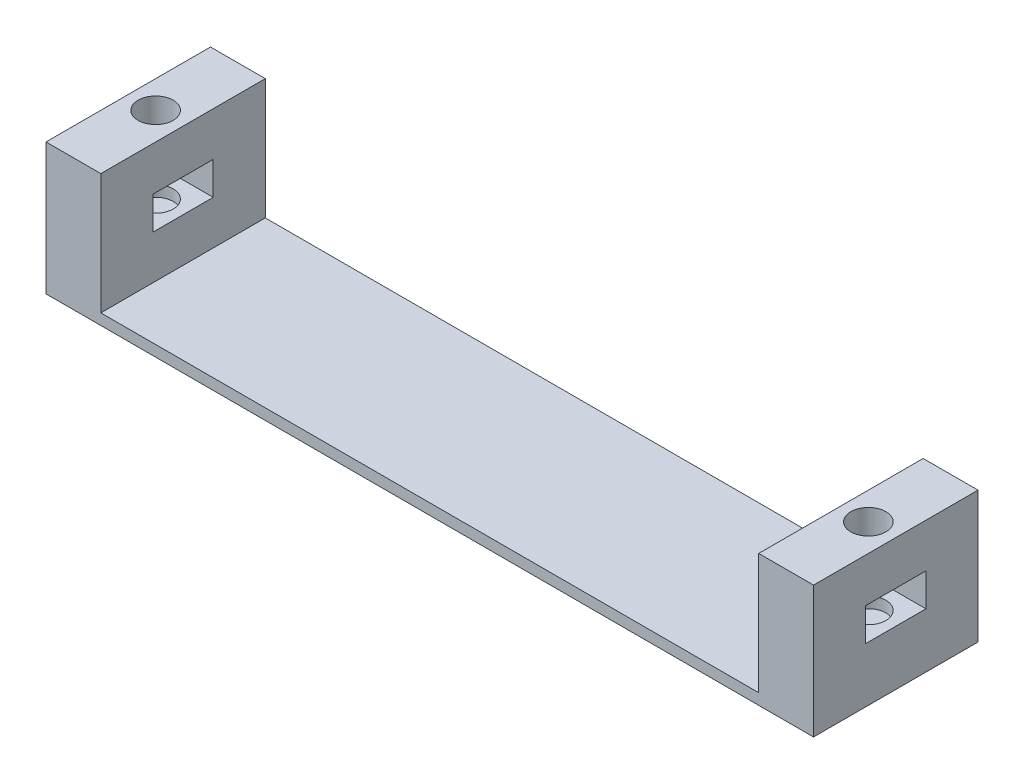
ISO-10303-21;
HEADER;
FILE_DESCRIPTION(('STEP AP214'),'2;1');
FILE_NAME('part.step','',(''),(''),'','','');
FILE_SCHEMA(('AUTOMOTIVE_DESIGN { 1 0 10303 214 1 1 1 1 }'));
ENDSEC;
DATA;
#1=APPLICATION_CONTEXT('core data for automotive mechanical design processes');
#2=APPLICATION_PROTOCOL_DEFINITION('international standard','automotive_design',2000,#1);
#3=PRODUCT_CONTEXT('',#1,'mechanical');
#4=PRODUCT('Part','Part','',(#3));
#5=PRODUCT_RELATED_PRODUCT_CATEGORY('part','',(#4));
#6=PRODUCT_DEFINITION_FORMATION('','',#4);
#7=PRODUCT_DEFINITION_CONTEXT('part definition',#1,'design');
#8=PRODUCT_DEFINITION('design','',#6,#7);
#9=PRODUCT_DEFINITION_SHAPE('','',#8);
#10=(LENGTH_UNIT() NAMED_UNIT(*) SI_UNIT(.MILLI.,.METRE.));
#11=(NAMED_UNIT(*) PLANE_ANGLE_UNIT() SI_UNIT($,.RADIAN.));
#12=(NAMED_UNIT(*) SI_UNIT($,.STERADIAN.) SOLID_ANGLE_UNIT());
#13=UNCERTAINTY_MEASURE_WITH_UNIT(LENGTH_MEASURE(1.E-05),#10,'distance_accuracy_value','');
#14=(GEOMETRIC_REPRESENTATION_CONTEXT(3) GLOBAL_UNCERTAINTY_ASSIGNED_CONTEXT((#13)) GLOBAL_UNIT_ASSIGNED_CONTEXT((#10,
#11,#12)) REPRESENTATION_CONTEXT('',''));
#15=CARTESIAN_POINT('',(0.,0.,0.));
#16=DIRECTION('',(0.,0.,1.));
#17=DIRECTION('',(1.,0.,0.));
#18=AXIS2_PLACEMENT_3D('',#15,#16,#17);
#19=CARTESIAN_POINT('',(32.5,4.,-1.22298005056365E-13));
#20=DIRECTION('',(0.,1.,0.));
#21=DIRECTION('',(0.,0.,1.));
#22=AXIS2_PLACEMENT_3D('',#19,#20,#21);
#23=CYLINDRICAL_SURFACE('',#22,1.6);
#24=CARTESIAN_POINT('',(32.5,8.,-1.22298005056365E-13));
#25=DIRECTION('',(0.,1.,0.));
#26=DIRECTION('',(0.,0.,1.));
#27=AXIS2_PLACEMENT_3D('',#24,#25,#26);
#28=CIRCLE('',#27,1.6);
#29=CARTESIAN_POINT('',(32.5,8.,1.59999999999988));
#30=VERTEX_POINT('',#29);
#31=EDGE_CURVE('E204',#30,#30,#28,.F.);
#32=ORIENTED_EDGE('',*,*,#31,.T.);
#33=EDGE_LOOP('',(#32));
#34=FACE_BOUND('',#33,.T.);
#35=CARTESIAN_POINT('',(32.5,12.,-1.22298005056365E-13));
#36=DIRECTION('',(0.,1.,0.));
#37=DIRECTION('',(0.,0.,-1.));
#38=AXIS2_PLACEMENT_3D('',#35,#36,#37);
#39=CIRCLE('',#38,1.6);
#40=CARTESIAN_POINT('',(32.5,12.,-1.60000000000012));
#41=VERTEX_POINT('',#40);
#42=EDGE_CURVE('E217',#41,#41,#39,.T.);
#43=ORIENTED_EDGE('',*,*,#42,.T.);
#44=EDGE_LOOP('',(#43));
#45=FACE_BOUND('',#44,.T.);
#46=ADVANCED_FACE('F33',(#34,#45),#23,.F.);
#47=CARTESIAN_POINT('',(-32.5,4.,0.));
#48=DIRECTION('',(0.,1.,0.));
#49=DIRECTION('',(0.,0.,1.));
#50=AXIS2_PLACEMENT_3D('',#47,#48,#49);
#51=CYLINDRICAL_SURFACE('',#50,1.6);
#52=CARTESIAN_POINT('',(-32.5,8.,0.));
#53=DIRECTION('',(0.,1.,0.));
#54=DIRECTION('',(0.,0.,1.));
#55=AXIS2_PLACEMENT_3D('',#52,#53,#54);
#56=CIRCLE('',#55,1.6);
#57=CARTESIAN_POINT('',(-32.5,8.,1.6));
#58=VERTEX_POINT('',#57);
#59=EDGE_CURVE('E203',#58,#58,#56,.F.);
#60=ORIENTED_EDGE('',*,*,#59,.T.);
#61=EDGE_LOOP('',(#60));
#62=FACE_BOUND('',#61,.T.);
#63=CARTESIAN_POINT('',(-32.5,12.,0.));
#64=DIRECTION('',(0.,1.,0.));
#65=DIRECTION('',(0.,0.,1.));
#66=AXIS2_PLACEMENT_3D('',#63,#64,#65);
#67=CIRCLE('',#66,1.6);
#68=CARTESIAN_POINT('',(-32.5,12.,1.6));
#69=VERTEX_POINT('',#68);
#70=EDGE_CURVE('E222',#69,#69,#67,.T.);
#71=ORIENTED_EDGE('',*,*,#70,.T.);
#72=EDGE_LOOP('',(#71));
#73=FACE_BOUND('',#72,.T.);
#74=ADVANCED_FACE('F347',(#62,#73),#51,.F.);
#75=CARTESIAN_POINT('',(0.,1.,0.));
#76=DIRECTION('',(0.,-1.,0.));
#77=DIRECTION('',(0.,0.,-1.));
#78=AXIS2_PLACEMENT_3D('',#75,#76,#77);
#79=PLANE('',#78);
#80=DIRECTION('',(0.,0.,1.));
#81=VECTOR('',#80,1.);
#82=CARTESIAN_POINT('',(30.,1.,7.5));
#83=LINE('',#82,#81);
#84=CARTESIAN_POINT('',(30.,1.,-7.5));
#85=VERTEX_POINT('',#84);
#86=CARTESIAN_POINT('',(30.,1.,7.5));
#87=VERTEX_POINT('',#86);
#88=EDGE_CURVE('E221',#85,#87,#83,.T.);
#89=ORIENTED_EDGE('',*,*,#88,.F.);
#90=DIRECTION('',(-1.,0.,0.));
#91=VECTOR('',#90,1.);
#92=CARTESIAN_POINT('',(-35.,1.,-7.5));
#93=LINE('',#92,#91);
#94=CARTESIAN_POINT('',(-30.,1.,-7.5));
#95=VERTEX_POINT('',#94);
#96=EDGE_CURVE('E269',#85,#95,#93,.T.);
#97=ORIENTED_EDGE('',*,*,#96,.T.);
#98=DIRECTION('',(0.,0.,-1.));
#99=VECTOR('',#98,1.);
#100=CARTESIAN_POINT('',(-30.,1.,-7.5));
#101=LINE('',#100,#99);
#102=CARTESIAN_POINT('',(-30.,1.,7.5));
#103=VERTEX_POINT('',#102);
#104=EDGE_CURVE('E249',#103,#95,#101,.T.);
#105=ORIENTED_EDGE('',*,*,#104,.F.);
#106=DIRECTION('',(1.,0.,0.));
#107=VECTOR('',#106,1.);
#108=CARTESIAN_POINT('',(-35.,1.,7.5));
#109=LINE('',#108,#107);
#110=EDGE_CURVE('E271',#103,#87,#109,.T.);
#111=ORIENTED_EDGE('',*,*,#110,.T.);
#112=EDGE_LOOP('',(#89,#97,#105,#111));
#113=FACE_BOUND('',#112,.T.);
#114=ADVANCED_FACE('F317',(#113),#79,.F.);
#115=CARTESIAN_POINT('',(35.,1.,7.5));
#116=DIRECTION('',(-1.,0.,0.));
#117=DIRECTION('',(0.,0.,1.));
#118=AXIS2_PLACEMENT_3D('',#115,#116,#117);
#119=PLANE('',#118);
#120=DIRECTION('',(0.,0.,-1.));
#121=VECTOR('',#120,1.);
#122=CARTESIAN_POINT('',(35.,5.,-2.75));
#123=LINE('',#122,#121);
#124=CARTESIAN_POINT('',(35.,5.,2.75));
#125=VERTEX_POINT('',#124);
#126=CARTESIAN_POINT('',(35.,5.,-2.75));
#127=VERTEX_POINT('',#126);
#128=EDGE_CURVE('E181',#125,#127,#123,.T.);
#129=ORIENTED_EDGE('',*,*,#128,.F.);
#130=DIRECTION('',(0.,-1.,0.));
#131=VECTOR('',#130,1.);
#132=CARTESIAN_POINT('',(35.,5.,2.75));
#133=LINE('',#132,#131);
#134=CARTESIAN_POINT('',(35.,8.,2.75));
#135=VERTEX_POINT('',#134);
#136=EDGE_CURVE('E48',#135,#125,#133,.T.);
#137=ORIENTED_EDGE('',*,*,#136,.F.);
#138=DIRECTION('',(0.,0.,1.));
#139=VECTOR('',#138,1.);
#140=CARTESIAN_POINT('',(35.,8.,2.75));
#141=LINE('',#140,#139);
#142=CARTESIAN_POINT('',(35.,8.,-2.75));
#143=VERTEX_POINT('',#142);
#144=EDGE_CURVE('E172',#143,#135,#141,.T.);
#145=ORIENTED_EDGE('',*,*,#144,.F.);
#146=DIRECTION('',(0.,1.,0.));
#147=VECTOR('',#146,1.);
#148=CARTESIAN_POINT('',(35.,5.,-2.75));
#149=LINE('',#148,#147);
#150=EDGE_CURVE('E175',#127,#143,#149,.T.);
#151=ORIENTED_EDGE('',*,*,#150,.F.);
#152=EDGE_LOOP('',(#129,#137,#145,#151));
#153=FACE_BOUND('',#152,.T.);
#154=DIRECTION('',(0.,0.,-1.));
#155=VECTOR('',#154,1.);
#156=CARTESIAN_POINT('',(35.,0.,7.5));
#157=LINE('',#156,#155);
#158=CARTESIAN_POINT('',(35.,0.,7.5));
#159=VERTEX_POINT('',#158);
#160=CARTESIAN_POINT('',(35.,0.,-7.5));
#161=VERTEX_POINT('',#160);
#162=EDGE_CURVE('E268',#159,#161,#157,.T.);
#163=ORIENTED_EDGE('',*,*,#162,.T.);
#164=DIRECTION('',(0.,-1.,0.));
#165=VECTOR('',#164,1.);
#166=CARTESIAN_POINT('',(35.,1.,-7.5));
#167=LINE('',#166,#165);
#168=CARTESIAN_POINT('',(35.,12.,-7.5));
#169=VERTEX_POINT('',#168);
#170=EDGE_CURVE('E290',#169,#161,#167,.T.);
#171=ORIENTED_EDGE('',*,*,#170,.F.);
#172=DIRECTION('',(0.,0.,-1.));
#173=VECTOR('',#172,1.);
#174=CARTESIAN_POINT('',(35.,12.,-7.5));
#175=LINE('',#174,#173);
#176=CARTESIAN_POINT('',(35.,12.,7.5));
#177=VERTEX_POINT('',#176);
#178=EDGE_CURVE('E238',#177,#169,#175,.T.);
#179=ORIENTED_EDGE('',*,*,#178,.F.);
#180=DIRECTION('',(0.,-1.,0.));
#181=VECTOR('',#180,1.);
#182=CARTESIAN_POINT('',(35.,1.,7.5));
#183=LINE('',#182,#181);
#184=EDGE_CURVE('E274',#177,#159,#183,.T.);
#185=ORIENTED_EDGE('',*,*,#184,.T.);
#186=EDGE_LOOP('',(#163,#171,#179,#185));
#187=FACE_BOUND('',#186,.T.);
#188=ADVANCED_FACE('F35',(#153,#187),#119,.F.);
#189=CARTESIAN_POINT('',(-35.,1.,-7.5));
#190=DIRECTION('',(0.,0.,1.));
#191=DIRECTION('',(1.,0.,0.));
#192=AXIS2_PLACEMENT_3D('',#189,#190,#191);
#193=PLANE('',#192);
#194=DIRECTION('',(-1.,0.,0.));
#195=VECTOR('',#194,1.);
#196=CARTESIAN_POINT('',(-35.,0.,-7.5));
#197=LINE('',#196,#195);
#198=CARTESIAN_POINT('',(-35.,0.,-7.5));
#199=VERTEX_POINT('',#198);
#200=EDGE_CURVE('E277',#161,#199,#197,.T.);
#201=ORIENTED_EDGE('',*,*,#200,.T.);
#202=DIRECTION('',(0.,-1.,0.));
#203=VECTOR('',#202,1.);
#204=CARTESIAN_POINT('',(-35.,1.,-7.5));
#205=LINE('',#204,#203);
#206=CARTESIAN_POINT('',(-35.,12.,-7.5));
#207=VERTEX_POINT('',#206);
#208=EDGE_CURVE('E287',#207,#199,#205,.T.);
#209=ORIENTED_EDGE('',*,*,#208,.F.);
#210=DIRECTION('',(-1.,0.,0.));
#211=VECTOR('',#210,1.);
#212=CARTESIAN_POINT('',(-35.,12.,-7.5));
#213=LINE('',#212,#211);
#214=CARTESIAN_POINT('',(-30.,12.,-7.5));
#215=VERTEX_POINT('',#214);
#216=EDGE_CURVE('E257',#215,#207,#213,.T.);
#217=ORIENTED_EDGE('',*,*,#216,.F.);
#218=DIRECTION('',(0.,-1.,0.));
#219=VECTOR('',#218,1.);
#220=CARTESIAN_POINT('',(-30.,12.,-7.5));
#221=LINE('',#220,#219);
#222=EDGE_CURVE('E260',#215,#95,#221,.T.);
#223=ORIENTED_EDGE('',*,*,#222,.T.);
#224=ORIENTED_EDGE('',*,*,#96,.F.);
#225=DIRECTION('',(0.,-1.,0.));
#226=VECTOR('',#225,1.);
#227=CARTESIAN_POINT('',(30.,12.,-7.5));
#228=LINE('',#227,#226);
#229=CARTESIAN_POINT('',(30.,12.,-7.5));
#230=VERTEX_POINT('',#229);
#231=EDGE_CURVE('E246',#230,#85,#228,.T.);
#232=ORIENTED_EDGE('',*,*,#231,.F.);
#233=DIRECTION('',(-1.,0.,0.));
#234=VECTOR('',#233,1.);
#235=CARTESIAN_POINT('',(30.,12.,-7.5));
#236=LINE('',#235,#234);
#237=EDGE_CURVE('E230',#169,#230,#236,.T.);
#238=ORIENTED_EDGE('',*,*,#237,.F.);
#239=ORIENTED_EDGE('',*,*,#170,.T.);
#240=EDGE_LOOP('',(#201,#209,#217,#223,#224,#232,#238,#239));
#241=FACE_BOUND('',#240,.T.);
#242=ADVANCED_FACE('F316',(#241),#193,.F.);
#243=CARTESIAN_POINT('',(-35.,1.,7.5));
#244=DIRECTION('',(1.,0.,0.));
#245=DIRECTION('',(0.,0.,-1.));
#246=AXIS2_PLACEMENT_3D('',#243,#244,#245);
#247=PLANE('',#246);
#248=DIRECTION('',(0.,0.,1.));
#249=VECTOR('',#248,1.);
#250=CARTESIAN_POINT('',(-35.,8.,2.75));
#251=LINE('',#250,#249);
#252=CARTESIAN_POINT('',(-35.,8.,-2.75));
#253=VERTEX_POINT('',#252);
#254=CARTESIAN_POINT('',(-35.,8.,2.75));
#255=VERTEX_POINT('',#254);
#256=EDGE_CURVE('E171',#253,#255,#251,.T.);
#257=ORIENTED_EDGE('',*,*,#256,.T.);
#258=DIRECTION('',(0.,-1.,0.));
#259=VECTOR('',#258,1.);
#260=CARTESIAN_POINT('',(-35.,5.,2.75));
#261=LINE('',#260,#259);
#262=CARTESIAN_POINT('',(-35.,5.,2.75));
#263=VERTEX_POINT('',#262);
#264=EDGE_CURVE('E153',#255,#263,#261,.T.);
#265=ORIENTED_EDGE('',*,*,#264,.T.);
#266=DIRECTION('',(0.,0.,-1.));
#267=VECTOR('',#266,1.);
#268=CARTESIAN_POINT('',(-35.,5.,-2.75));
#269=LINE('',#268,#267);
#270=CARTESIAN_POINT('',(-35.,5.,-2.75));
#271=VERTEX_POINT('',#270);
#272=EDGE_CURVE('E163',#263,#271,#269,.T.);
#273=ORIENTED_EDGE('',*,*,#272,.T.);
#274=DIRECTION('',(0.,1.,0.));
#275=VECTOR('',#274,1.);
#276=CARTESIAN_POINT('',(-35.,5.,-2.75));
#277=LINE('',#276,#275);
#278=EDGE_CURVE('E56',#271,#253,#277,.T.);
#279=ORIENTED_EDGE('',*,*,#278,.T.);
#280=EDGE_LOOP('',(#257,#265,#273,#279));
#281=FACE_BOUND('',#280,.T.);
#282=DIRECTION('',(0.,0.,1.));
#283=VECTOR('',#282,1.);
#284=CARTESIAN_POINT('',(-35.,0.,7.5));
#285=LINE('',#284,#283);
#286=CARTESIAN_POINT('',(-35.,0.,7.5));
#287=VERTEX_POINT('',#286);
#288=EDGE_CURVE('E279',#199,#287,#285,.T.);
#289=ORIENTED_EDGE('',*,*,#288,.T.);
#290=DIRECTION('',(0.,-1.,0.));
#291=VECTOR('',#290,1.);
#292=CARTESIAN_POINT('',(-35.,1.,7.5));
#293=LINE('',#292,#291);
#294=CARTESIAN_POINT('',(-35.,12.,7.5));
#295=VERTEX_POINT('',#294);
#296=EDGE_CURVE('E284',#295,#287,#293,.T.);
#297=ORIENTED_EDGE('',*,*,#296,.F.);
#298=DIRECTION('',(0.,0.,1.));
#299=VECTOR('',#298,1.);
#300=CARTESIAN_POINT('',(-35.,12.,7.5));
#301=LINE('',#300,#299);
#302=EDGE_CURVE('E250',#207,#295,#301,.T.);
#303=ORIENTED_EDGE('',*,*,#302,.F.);
#304=ORIENTED_EDGE('',*,*,#208,.T.);
#305=EDGE_LOOP('',(#289,#297,#303,#304));
#306=FACE_BOUND('',#305,.T.);
#307=ADVANCED_FACE('F168',(#281,#306),#247,.F.);
#308=CARTESIAN_POINT('',(-35.,1.,7.5));
#309=DIRECTION('',(0.,0.,-1.));
#310=DIRECTION('',(-1.,0.,0.));
#311=AXIS2_PLACEMENT_3D('',#308,#309,#310);
#312=PLANE('',#311);
#313=DIRECTION('',(1.,0.,0.));
#314=VECTOR('',#313,1.);
#315=CARTESIAN_POINT('',(-35.,0.,7.5));
#316=LINE('',#315,#314);
#317=EDGE_CURVE('E272',#287,#159,#316,.T.);
#318=ORIENTED_EDGE('',*,*,#317,.T.);
#319=ORIENTED_EDGE('',*,*,#184,.F.);
#320=DIRECTION('',(1.,0.,0.));
#321=VECTOR('',#320,1.);
#322=CARTESIAN_POINT('',(35.,12.,7.5));
#323=LINE('',#322,#321);
#324=CARTESIAN_POINT('',(30.,12.,7.5));
#325=VERTEX_POINT('',#324);
#326=EDGE_CURVE('E235',#325,#177,#323,.T.);
#327=ORIENTED_EDGE('',*,*,#326,.F.);
#328=DIRECTION('',(0.,-1.,0.));
#329=VECTOR('',#328,1.);
#330=CARTESIAN_POINT('',(30.,12.,7.5));
#331=LINE('',#330,#329);
#332=EDGE_CURVE('E241',#325,#87,#331,.T.);
#333=ORIENTED_EDGE('',*,*,#332,.T.);
#334=ORIENTED_EDGE('',*,*,#110,.F.);
#335=DIRECTION('',(0.,-1.,0.));
#336=VECTOR('',#335,1.);
#337=CARTESIAN_POINT('',(-30.,12.,7.5));
#338=LINE('',#337,#336);
#339=CARTESIAN_POINT('',(-30.,12.,7.5));
#340=VERTEX_POINT('',#339);
#341=EDGE_CURVE('E265',#340,#103,#338,.T.);
#342=ORIENTED_EDGE('',*,*,#341,.F.);
#343=DIRECTION('',(1.,0.,0.));
#344=VECTOR('',#343,1.);
#345=CARTESIAN_POINT('',(-30.,12.,7.5));
#346=LINE('',#345,#344);
#347=EDGE_CURVE('E253',#295,#340,#346,.T.);
#348=ORIENTED_EDGE('',*,*,#347,.F.);
#349=ORIENTED_EDGE('',*,*,#296,.T.);
#350=EDGE_LOOP('',(#318,#319,#327,#333,#334,#342,#348,#349));
#351=FACE_BOUND('',#350,.T.);
#352=ADVANCED_FACE('F333',(#351),#312,.F.);
#353=CARTESIAN_POINT('',(0.,0.,0.));
#354=DIRECTION('',(0.,-1.,0.));
#355=DIRECTION('',(0.,0.,-1.));
#356=AXIS2_PLACEMENT_3D('',#353,#354,#355);
#357=PLANE('',#356);
#358=ORIENTED_EDGE('',*,*,#162,.F.);
#359=ORIENTED_EDGE('',*,*,#317,.F.);
#360=ORIENTED_EDGE('',*,*,#288,.F.);
#361=ORIENTED_EDGE('',*,*,#200,.F.);
#362=EDGE_LOOP('',(#358,#359,#360,#361));
#363=FACE_BOUND('',#362,.T.);
#364=ADVANCED_FACE('F322',(#363),#357,.T.);
#365=CARTESIAN_POINT('',(-30.,12.,-7.5));
#366=DIRECTION('',(-1.,0.,0.));
#367=DIRECTION('',(0.,0.,1.));
#368=AXIS2_PLACEMENT_3D('',#365,#366,#367);
#369=PLANE('',#368);
#370=DIRECTION('',(0.,0.,1.));
#371=VECTOR('',#370,1.);
#372=CARTESIAN_POINT('',(-30.,5.,-7.5));
#373=LINE('',#372,#371);
#374=CARTESIAN_POINT('',(-30.,5.,-2.75));
#375=VERTEX_POINT('',#374);
#376=CARTESIAN_POINT('',(-30.,5.,2.75));
#377=VERTEX_POINT('',#376);
#378=EDGE_CURVE('E201',#375,#377,#373,.T.);
#379=ORIENTED_EDGE('',*,*,#378,.T.);
#380=DIRECTION('',(0.,1.,0.));
#381=VECTOR('',#380,1.);
#382=CARTESIAN_POINT('',(-30.,12.,2.75));
#383=LINE('',#382,#381);
#384=CARTESIAN_POINT('',(-30.,8.,2.75));
#385=VERTEX_POINT('',#384);
#386=EDGE_CURVE('E156',#377,#385,#383,.T.);
#387=ORIENTED_EDGE('',*,*,#386,.T.);
#388=DIRECTION('',(0.,0.,-1.));
#389=VECTOR('',#388,1.);
#390=CARTESIAN_POINT('',(-30.,8.,-7.5));
#391=LINE('',#390,#389);
#392=CARTESIAN_POINT('',(-30.,8.,-2.75));
#393=VERTEX_POINT('',#392);
#394=EDGE_CURVE('E210',#385,#393,#391,.T.);
#395=ORIENTED_EDGE('',*,*,#394,.T.);
#396=DIRECTION('',(0.,-1.,0.));
#397=VECTOR('',#396,1.);
#398=CARTESIAN_POINT('',(-30.,12.,-2.75));
#399=LINE('',#398,#397);
#400=EDGE_CURVE('E213',#393,#375,#399,.T.);
#401=ORIENTED_EDGE('',*,*,#400,.T.);
#402=EDGE_LOOP('',(#379,#387,#395,#401));
#403=FACE_BOUND('',#402,.T.);
#404=ORIENTED_EDGE('',*,*,#104,.T.);
#405=ORIENTED_EDGE('',*,*,#222,.F.);
#406=DIRECTION('',(0.,0.,-1.));
#407=VECTOR('',#406,1.);
#408=CARTESIAN_POINT('',(-30.,12.,-7.5));
#409=LINE('',#408,#407);
#410=EDGE_CURVE('E255',#340,#215,#409,.T.);
#411=ORIENTED_EDGE('',*,*,#410,.F.);
#412=ORIENTED_EDGE('',*,*,#341,.T.);
#413=EDGE_LOOP('',(#404,#405,#411,#412));
#414=FACE_BOUND('',#413,.T.);
#415=ADVANCED_FACE('F344',(#403,#414),#369,.F.);
#416=CARTESIAN_POINT('',(0.,12.,0.));
#417=DIRECTION('',(0.,-1.,0.));
#418=DIRECTION('',(0.,0.,-1.));
#419=AXIS2_PLACEMENT_3D('',#416,#417,#418);
#420=PLANE('',#419);
#421=ORIENTED_EDGE('',*,*,#70,.F.);
#422=EDGE_LOOP('',(#421));
#423=FACE_BOUND('',#422,.T.);
#424=ORIENTED_EDGE('',*,*,#302,.T.);
#425=ORIENTED_EDGE('',*,*,#347,.T.);
#426=ORIENTED_EDGE('',*,*,#410,.T.);
#427=ORIENTED_EDGE('',*,*,#216,.T.);
#428=EDGE_LOOP('',(#424,#425,#426,#427));
#429=FACE_BOUND('',#428,.T.);
#430=ADVANCED_FACE('F340',(#423,#429),#420,.F.);
#431=CARTESIAN_POINT('',(30.,12.,7.5));
#432=DIRECTION('',(1.,0.,0.));
#433=DIRECTION('',(0.,0.,-1.));
#434=AXIS2_PLACEMENT_3D('',#431,#432,#433);
#435=PLANE('',#434);
#436=DIRECTION('',(0.,0.,1.));
#437=VECTOR('',#436,1.);
#438=CARTESIAN_POINT('',(30.,8.,7.5));
#439=LINE('',#438,#437);
#440=CARTESIAN_POINT('',(30.,8.,-2.75));
#441=VERTEX_POINT('',#440);
#442=CARTESIAN_POINT('',(30.,8.,2.75));
#443=VERTEX_POINT('',#442);
#444=EDGE_CURVE('E207',#441,#443,#439,.T.);
#445=ORIENTED_EDGE('',*,*,#444,.T.);
#446=DIRECTION('',(0.,-1.,0.));
#447=VECTOR('',#446,1.);
#448=CARTESIAN_POINT('',(30.,12.,2.75));
#449=LINE('',#448,#447);
#450=CARTESIAN_POINT('',(30.,5.,2.75));
#451=VERTEX_POINT('',#450);
#452=EDGE_CURVE('E11',#443,#451,#449,.T.);
#453=ORIENTED_EDGE('',*,*,#452,.T.);
#454=DIRECTION('',(0.,0.,-1.));
#455=VECTOR('',#454,1.);
#456=CARTESIAN_POINT('',(30.,5.,7.5));
#457=LINE('',#456,#455);
#458=CARTESIAN_POINT('',(30.,5.,-2.75));
#459=VERTEX_POINT('',#458);
#460=EDGE_CURVE('E198',#451,#459,#457,.T.);
#461=ORIENTED_EDGE('',*,*,#460,.T.);
#462=DIRECTION('',(0.,1.,0.));
#463=VECTOR('',#462,1.);
#464=CARTESIAN_POINT('',(30.,12.,-2.75));
#465=LINE('',#464,#463);
#466=EDGE_CURVE('E41',#459,#441,#465,.T.);
#467=ORIENTED_EDGE('',*,*,#466,.T.);
#468=EDGE_LOOP('',(#445,#453,#461,#467));
#469=FACE_BOUND('',#468,.T.);
#470=ORIENTED_EDGE('',*,*,#88,.T.);
#471=ORIENTED_EDGE('',*,*,#332,.F.);
#472=DIRECTION('',(0.,0.,1.));
#473=VECTOR('',#472,1.);
#474=CARTESIAN_POINT('',(30.,12.,7.5));
#475=LINE('',#474,#473);
#476=EDGE_CURVE('E233',#230,#325,#475,.T.);
#477=ORIENTED_EDGE('',*,*,#476,.F.);
#478=ORIENTED_EDGE('',*,*,#231,.T.);
#479=EDGE_LOOP('',(#470,#471,#477,#478));
#480=FACE_BOUND('',#479,.T.);
#481=ADVANCED_FACE('F299',(#469,#480),#435,.F.);
#482=CARTESIAN_POINT('',(0.,12.,0.));
#483=DIRECTION('',(0.,-1.,0.));
#484=DIRECTION('',(0.,0.,-1.));
#485=AXIS2_PLACEMENT_3D('',#482,#483,#484);
#486=PLANE('',#485);
#487=ORIENTED_EDGE('',*,*,#42,.F.);
#488=EDGE_LOOP('',(#487));
#489=FACE_BOUND('',#488,.T.);
#490=ORIENTED_EDGE('',*,*,#237,.T.);
#491=ORIENTED_EDGE('',*,*,#476,.T.);
#492=ORIENTED_EDGE('',*,*,#326,.T.);
#493=ORIENTED_EDGE('',*,*,#178,.T.);
#494=EDGE_LOOP('',(#490,#491,#492,#493));
#495=FACE_BOUND('',#494,.T.);
#496=ADVANCED_FACE('F329',(#489,#495),#486,.F.);
#497=CARTESIAN_POINT('',(-35.,5.,-2.75));
#498=DIRECTION('',(0.,-1.,0.));
#499=DIRECTION('',(0.,0.,-1.));
#500=AXIS2_PLACEMENT_3D('',#497,#498,#499);
#501=PLANE('',#500);
#502=CARTESIAN_POINT('',(-32.5,5.,0.));
#503=DIRECTION('',(0.,-1.,0.));
#504=DIRECTION('',(0.,0.,-1.));
#505=AXIS2_PLACEMENT_3D('',#502,#503,#504);
#506=CIRCLE('',#505,1.6);
#507=CARTESIAN_POINT('',(-32.5,5.,-1.6));
#508=VERTEX_POINT('',#507);
#509=EDGE_CURVE('E188',#508,#508,#506,.F.);
#510=ORIENTED_EDGE('',*,*,#509,.F.);
#511=EDGE_LOOP('',(#510));
#512=FACE_BOUND('',#511,.T.);
#513=DIRECTION('',(1.,0.,0.));
#514=VECTOR('',#513,1.);
#515=CARTESIAN_POINT('',(-35.,5.,-2.75));
#516=LINE('',#515,#514);
#517=EDGE_CURVE('E165',#271,#375,#516,.T.);
#518=ORIENTED_EDGE('',*,*,#517,.F.);
#519=ORIENTED_EDGE('',*,*,#272,.F.);
#520=DIRECTION('',(1.,0.,0.));
#521=VECTOR('',#520,1.);
#522=CARTESIAN_POINT('',(-35.,5.,2.75));
#523=LINE('',#522,#521);
#524=EDGE_CURVE('E148',#263,#377,#523,.T.);
#525=ORIENTED_EDGE('',*,*,#524,.T.);
#526=ORIENTED_EDGE('',*,*,#378,.F.);
#527=EDGE_LOOP('',(#518,#519,#525,#526));
#528=FACE_BOUND('',#527,.T.);
#529=ADVANCED_FACE('F164',(#512,#528),#501,.F.);
#530=CARTESIAN_POINT('',(-35.,8.,2.75));
#531=DIRECTION('',(0.,1.,0.));
#532=DIRECTION('',(0.,0.,1.));
#533=AXIS2_PLACEMENT_3D('',#530,#531,#532);
#534=PLANE('',#533);
#535=ORIENTED_EDGE('',*,*,#59,.F.);
#536=EDGE_LOOP('',(#535));
#537=FACE_BOUND('',#536,.T.);
#538=DIRECTION('',(1.,0.,0.));
#539=VECTOR('',#538,1.);
#540=CARTESIAN_POINT('',(-35.,8.,2.75));
#541=LINE('',#540,#539);
#542=EDGE_CURVE('E186',#255,#385,#541,.T.);
#543=ORIENTED_EDGE('',*,*,#542,.F.);
#544=ORIENTED_EDGE('',*,*,#256,.F.);
#545=DIRECTION('',(1.,0.,0.));
#546=VECTOR('',#545,1.);
#547=CARTESIAN_POINT('',(-35.,8.,-2.75));
#548=LINE('',#547,#546);
#549=EDGE_CURVE('E190',#253,#393,#548,.T.);
#550=ORIENTED_EDGE('',*,*,#549,.T.);
#551=ORIENTED_EDGE('',*,*,#394,.F.);
#552=EDGE_LOOP('',(#543,#544,#550,#551));
#553=FACE_BOUND('',#552,.T.);
#554=ADVANCED_FACE('F388',(#537,#553),#534,.F.);
#555=CARTESIAN_POINT('',(-35.,5.,-2.75));
#556=DIRECTION('',(0.,0.,-1.));
#557=DIRECTION('',(0.,1.,0.));
#558=AXIS2_PLACEMENT_3D('',#555,#556,#557);
#559=PLANE('',#558);
#560=ORIENTED_EDGE('',*,*,#549,.F.);
#561=ORIENTED_EDGE('',*,*,#278,.F.);
#562=ORIENTED_EDGE('',*,*,#517,.T.);
#563=ORIENTED_EDGE('',*,*,#400,.F.);
#564=EDGE_LOOP('',(#560,#561,#562,#563));
#565=FACE_BOUND('',#564,.T.);
#566=ADVANCED_FACE('F397',(#565),#559,.F.);
#567=CARTESIAN_POINT('',(-35.,5.,2.75));
#568=DIRECTION('',(0.,0.,1.));
#569=DIRECTION('',(1.,0.,0.));
#570=AXIS2_PLACEMENT_3D('',#567,#568,#569);
#571=PLANE('',#570);
#572=ORIENTED_EDGE('',*,*,#524,.F.);
#573=ORIENTED_EDGE('',*,*,#264,.F.);
#574=ORIENTED_EDGE('',*,*,#542,.T.);
#575=ORIENTED_EDGE('',*,*,#386,.F.);
#576=EDGE_LOOP('',(#572,#573,#574,#575));
#577=FACE_BOUND('',#576,.T.);
#578=ADVANCED_FACE('F150',(#577),#571,.F.);
#579=EDGE_CURVE('E189',#443,#135,#541,.T.);
#580=ORIENTED_EDGE('',*,*,#579,.T.);
#581=ORIENTED_EDGE('',*,*,#136,.T.);
#582=EDGE_CURVE('E160',#451,#125,#523,.T.);
#583=ORIENTED_EDGE('',*,*,#582,.F.);
#584=ORIENTED_EDGE('',*,*,#452,.F.);
#585=EDGE_LOOP('',(#580,#581,#583,#584));
#586=FACE_BOUND('',#585,.T.);
#587=ADVANCED_FACE('F309',(#586),#571,.F.);
#588=EDGE_CURVE('E159',#459,#127,#516,.T.);
#589=ORIENTED_EDGE('',*,*,#588,.T.);
#590=ORIENTED_EDGE('',*,*,#150,.T.);
#591=EDGE_CURVE('E193',#441,#143,#548,.T.);
#592=ORIENTED_EDGE('',*,*,#591,.F.);
#593=ORIENTED_EDGE('',*,*,#466,.F.);
#594=EDGE_LOOP('',(#589,#590,#592,#593));
#595=FACE_BOUND('',#594,.T.);
#596=ADVANCED_FACE('F303',(#595),#559,.F.);
#597=ORIENTED_EDGE('',*,*,#31,.F.);
#598=EDGE_LOOP('',(#597));
#599=FACE_BOUND('',#598,.T.);
#600=ORIENTED_EDGE('',*,*,#591,.T.);
#601=ORIENTED_EDGE('',*,*,#144,.T.);
#602=ORIENTED_EDGE('',*,*,#579,.F.);
#603=ORIENTED_EDGE('',*,*,#444,.F.);
#604=EDGE_LOOP('',(#600,#601,#602,#603));
#605=FACE_BOUND('',#604,.T.);
#606=ADVANCED_FACE('F307',(#599,#605),#534,.F.);
#607=CARTESIAN_POINT('',(32.5,5.,-1.22298005056365E-13));
#608=DIRECTION('',(0.,-1.,0.));
#609=DIRECTION('',(0.,0.,-1.));
#610=AXIS2_PLACEMENT_3D('',#607,#608,#609);
#611=CIRCLE('',#610,1.6);
#612=CARTESIAN_POINT('',(32.5,5.,-1.60000000000012));
#613=VERTEX_POINT('',#612);
#614=EDGE_CURVE('E195',#613,#613,#611,.F.);
#615=ORIENTED_EDGE('',*,*,#614,.F.);
#616=EDGE_LOOP('',(#615));
#617=FACE_BOUND('',#616,.T.);
#618=ORIENTED_EDGE('',*,*,#582,.T.);
#619=ORIENTED_EDGE('',*,*,#128,.T.);
#620=ORIENTED_EDGE('',*,*,#588,.F.);
#621=ORIENTED_EDGE('',*,*,#460,.F.);
#622=EDGE_LOOP('',(#618,#619,#620,#621));
#623=FACE_BOUND('',#622,.T.);
#624=ADVANCED_FACE('F312',(#617,#623),#501,.F.);
#625=CARTESIAN_POINT('',(-32.5,4.,0.));
#626=DIRECTION('',(0.,1.,0.));
#627=DIRECTION('',(0.,0.,1.));
#628=AXIS2_PLACEMENT_3D('',#625,#626,#627);
#629=PLANE('',#628);
#630=CARTESIAN_POINT('',(-32.5,4.,0.));
#631=DIRECTION('',(0.,1.,0.));
#632=DIRECTION('',(0.,0.,1.));
#633=AXIS2_PLACEMENT_3D('',#630,#631,#632);
#634=CIRCLE('',#633,1.6);
#635=CARTESIAN_POINT('',(-32.5,4.,1.6));
#636=VERTEX_POINT('',#635);
#637=EDGE_CURVE('E218',#636,#636,#634,.T.);
#638=ORIENTED_EDGE('',*,*,#637,.T.);
#639=EDGE_LOOP('',(#638));
#640=FACE_BOUND('',#639,.T.);
#641=ADVANCED_FACE('F378',(#640),#629,.T.);
#642=ORIENTED_EDGE('',*,*,#509,.T.);
#643=EDGE_LOOP('',(#642));
#644=FACE_BOUND('',#643,.T.);
#645=ORIENTED_EDGE('',*,*,#637,.F.);
#646=EDGE_LOOP('',(#645));
#647=FACE_BOUND('',#646,.T.);
#648=ADVANCED_FACE('F354',(#644,#647),#51,.F.);
#649=CARTESIAN_POINT('',(32.5,4.,-1.22298005056365E-13));
#650=DIRECTION('',(0.,-1.,0.));
#651=DIRECTION('',(0.,0.,-1.));
#652=AXIS2_PLACEMENT_3D('',#649,#650,#651);
#653=PLANE('',#652);
#654=CARTESIAN_POINT('',(32.5,4.,-1.22298005056365E-13));
#655=DIRECTION('',(0.,1.,0.));
#656=DIRECTION('',(0.,0.,-1.));
#657=AXIS2_PLACEMENT_3D('',#654,#655,#656);
#658=CIRCLE('',#657,1.6);
#659=CARTESIAN_POINT('',(32.5,4.,-1.60000000000012));
#660=VERTEX_POINT('',#659);
#661=EDGE_CURVE('E225',#660,#660,#658,.T.);
#662=ORIENTED_EDGE('',*,*,#661,.T.);
#663=EDGE_LOOP('',(#662));
#664=FACE_BOUND('',#663,.T.);
#665=ADVANCED_FACE('F367',(#664),#653,.F.);
#666=ORIENTED_EDGE('',*,*,#614,.T.);
#667=EDGE_LOOP('',(#666));
#668=FACE_BOUND('',#667,.T.);
#669=ORIENTED_EDGE('',*,*,#661,.F.);
#670=EDGE_LOOP('',(#669));
#671=FACE_BOUND('',#670,.T.);
#672=ADVANCED_FACE('F360',(#668,#671),#23,.F.);
#673=CLOSED_SHELL('',(#46,#74,#114,#188,#242,#307,#352,#364,#415,#430,#481,#496,#529,#554,#566,
#578,#587,#596,#606,#624,#641,#648,#665,#672));
#674=MANIFOLD_SOLID_BREP('B2',#673);
#675=ADVANCED_BREP_SHAPE_REPRESENTATION('',(#18,#674),#14);
#676=SHAPE_DEFINITION_REPRESENTATION(#9,#675);
ENDSEC;
END-ISO-10303-21;
